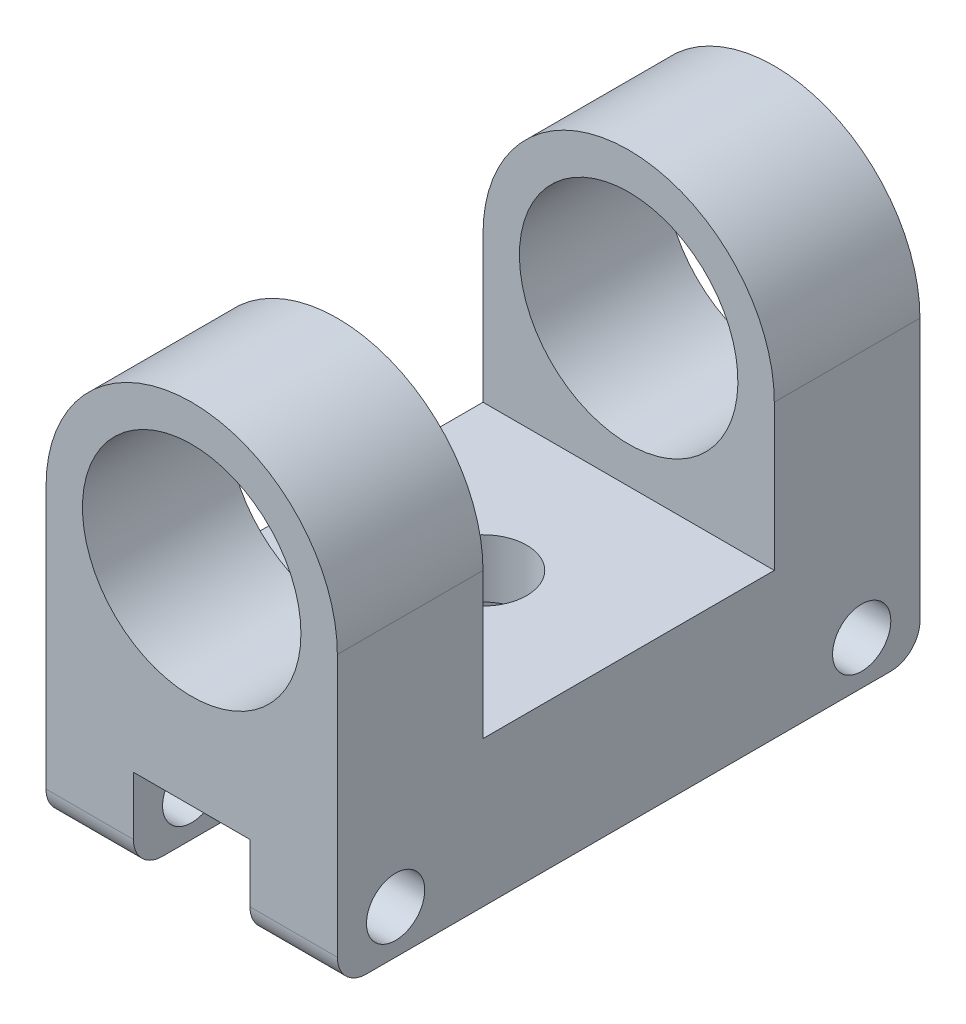
ISO-10303-21;
HEADER;
FILE_DESCRIPTION(('STEP AP214'),'2;1');
FILE_NAME('part.step','',(''),(''),'','','');
FILE_SCHEMA(('AUTOMOTIVE_DESIGN { 1 0 10303 214 1 1 1 1 }'));
ENDSEC;
DATA;
#1=APPLICATION_CONTEXT('core data for automotive mechanical design processes');
#2=APPLICATION_PROTOCOL_DEFINITION('international standard','automotive_design',2000,#1);
#3=PRODUCT_CONTEXT('',#1,'mechanical');
#4=PRODUCT('Part','Part','',(#3));
#5=PRODUCT_RELATED_PRODUCT_CATEGORY('part','',(#4));
#6=PRODUCT_DEFINITION_FORMATION('','',#4);
#7=PRODUCT_DEFINITION_CONTEXT('part definition',#1,'design');
#8=PRODUCT_DEFINITION('design','',#6,#7);
#9=PRODUCT_DEFINITION_SHAPE('','',#8);
#10=(LENGTH_UNIT() NAMED_UNIT(*) SI_UNIT(.MILLI.,.METRE.));
#11=(NAMED_UNIT(*) PLANE_ANGLE_UNIT() SI_UNIT($,.RADIAN.));
#12=(NAMED_UNIT(*) SI_UNIT($,.STERADIAN.) SOLID_ANGLE_UNIT());
#13=UNCERTAINTY_MEASURE_WITH_UNIT(LENGTH_MEASURE(1.E-05),#10,'distance_accuracy_value','');
#14=(GEOMETRIC_REPRESENTATION_CONTEXT(3) GLOBAL_UNCERTAINTY_ASSIGNED_CONTEXT((#13)) GLOBAL_UNIT_ASSIGNED_CONTEXT((#10,
#11,#12)) REPRESENTATION_CONTEXT('',''));
#15=CARTESIAN_POINT('',(0.,0.,0.));
#16=DIRECTION('',(0.,0.,1.));
#17=DIRECTION('',(1.,0.,0.));
#18=AXIS2_PLACEMENT_3D('',#15,#16,#17);
#19=CARTESIAN_POINT('',(50.,100.,200.));
#20=DIRECTION('',(0.,0.,-1.));
#21=DIRECTION('',(-1.,0.,0.));
#22=AXIS2_PLACEMENT_3D('',#19,#20,#21);
#23=CYLINDRICAL_SURFACE('',#22,50.);
#24=CARTESIAN_POINT('',(50.,100.,50.));
#25=DIRECTION('',(0.,0.,-1.));
#26=DIRECTION('',(0.,1.,0.));
#27=AXIS2_PLACEMENT_3D('',#24,#25,#26);
#28=CIRCLE('',#27,50.);
#29=CARTESIAN_POINT('',(0.,100.,50.));
#30=VERTEX_POINT('',#29);
#31=CARTESIAN_POINT('',(100.,100.,50.));
#32=VERTEX_POINT('',#31);
#33=EDGE_CURVE('E240',#30,#32,#28,.T.);
#34=ORIENTED_EDGE('',*,*,#33,.T.);
#35=DIRECTION('',(0.,0.,-1.));
#36=VECTOR('',#35,1.);
#37=CARTESIAN_POINT('',(100.,100.,200.));
#38=LINE('',#37,#36);
#39=CARTESIAN_POINT('',(100.,100.,0.));
#40=VERTEX_POINT('',#39);
#41=EDGE_CURVE('E272',#32,#40,#38,.T.);
#42=ORIENTED_EDGE('',*,*,#41,.T.);
#43=CARTESIAN_POINT('',(50.,100.,0.));
#44=DIRECTION('',(0.,0.,1.));
#45=DIRECTION('',(1.,0.,0.));
#46=AXIS2_PLACEMENT_3D('',#43,#44,#45);
#47=CIRCLE('',#46,50.);
#48=CARTESIAN_POINT('',(0.,100.,0.));
#49=VERTEX_POINT('',#48);
#50=EDGE_CURVE('E248',#40,#49,#47,.T.);
#51=ORIENTED_EDGE('',*,*,#50,.T.);
#52=DIRECTION('',(0.,0.,-1.));
#53=VECTOR('',#52,1.);
#54=CARTESIAN_POINT('',(0.,100.,200.));
#55=LINE('',#54,#53);
#56=EDGE_CURVE('E319',#30,#49,#55,.T.);
#57=ORIENTED_EDGE('',*,*,#56,.F.);
#58=EDGE_LOOP('',(#34,#42,#51,#57));
#59=FACE_BOUND('',#58,.T.);
#60=ADVANCED_FACE('F72',(#59),#23,.T.);
#61=CARTESIAN_POINT('',(50.,100.,200.));
#62=DIRECTION('',(0.,0.,-1.));
#63=DIRECTION('',(-1.,0.,0.));
#64=AXIS2_PLACEMENT_3D('',#61,#62,#63);
#65=CYLINDRICAL_SURFACE('',#64,37.5);
#66=CARTESIAN_POINT('',(50.,100.,50.));
#67=DIRECTION('',(0.,0.,-1.));
#68=DIRECTION('',(0.,1.,0.));
#69=AXIS2_PLACEMENT_3D('',#66,#67,#68);
#70=CIRCLE('',#69,37.5);
#71=CARTESIAN_POINT('',(50.,137.5,50.));
#72=VERTEX_POINT('',#71);
#73=EDGE_CURVE('E239',#72,#72,#70,.T.);
#74=ORIENTED_EDGE('',*,*,#73,.F.);
#75=EDGE_LOOP('',(#74));
#76=FACE_BOUND('',#75,.T.);
#77=CARTESIAN_POINT('',(50.,100.,0.));
#78=DIRECTION('',(0.,0.,1.));
#79=DIRECTION('',(1.,0.,0.));
#80=AXIS2_PLACEMENT_3D('',#77,#78,#79);
#81=CIRCLE('',#80,37.5);
#82=CARTESIAN_POINT('',(87.5,100.,0.));
#83=VERTEX_POINT('',#82);
#84=EDGE_CURVE('E243',#83,#83,#81,.T.);
#85=ORIENTED_EDGE('',*,*,#84,.F.);
#86=EDGE_LOOP('',(#85));
#87=FACE_BOUND('',#86,.T.);
#88=ADVANCED_FACE('F442',(#76,#87),#65,.F.);
#89=CARTESIAN_POINT('',(50.,100.,200.));
#90=DIRECTION('',(0.,0.,1.));
#91=DIRECTION('',(1.,0.,0.));
#92=AXIS2_PLACEMENT_3D('',#89,#90,#91);
#93=PLANE('',#92);
#94=DIRECTION('',(0.,1.,0.));
#95=VECTOR('',#94,1.);
#96=CARTESIAN_POINT('',(0.,0.,200.));
#97=LINE('',#96,#95);
#98=CARTESIAN_POINT('',(0.,9.99999999999999,200.));
#99=VERTEX_POINT('',#98);
#100=CARTESIAN_POINT('',(0.,100.,200.));
#101=VERTEX_POINT('',#100);
#102=EDGE_CURVE('E256',#99,#101,#97,.T.);
#103=ORIENTED_EDGE('',*,*,#102,.F.);
#104=DIRECTION('',(1.,0.,0.));
#105=VECTOR('',#104,1.);
#106=CARTESIAN_POINT('',(30.,9.99999999999999,200.));
#107=LINE('',#106,#105);
#108=CARTESIAN_POINT('',(30.,9.99999999999999,200.));
#109=VERTEX_POINT('',#108);
#110=EDGE_CURVE('E12',#99,#109,#107,.T.);
#111=ORIENTED_EDGE('',*,*,#110,.T.);
#112=DIRECTION('',(0.,1.,0.));
#113=VECTOR('',#112,1.);
#114=CARTESIAN_POINT('',(30.,0.,200.));
#115=LINE('',#114,#113);
#116=CARTESIAN_POINT('',(30.,30.,200.));
#117=VERTEX_POINT('',#116);
#118=EDGE_CURVE('E260',#109,#117,#115,.T.);
#119=ORIENTED_EDGE('',*,*,#118,.T.);
#120=DIRECTION('',(1.,0.,0.));
#121=VECTOR('',#120,1.);
#122=CARTESIAN_POINT('',(30.,30.,200.));
#123=LINE('',#122,#121);
#124=CARTESIAN_POINT('',(70.,30.,200.));
#125=VERTEX_POINT('',#124);
#126=EDGE_CURVE('E263',#117,#125,#123,.T.);
#127=ORIENTED_EDGE('',*,*,#126,.T.);
#128=DIRECTION('',(0.,-1.,0.));
#129=VECTOR('',#128,1.);
#130=CARTESIAN_POINT('',(70.,30.,200.));
#131=LINE('',#130,#129);
#132=CARTESIAN_POINT('',(70.,9.99999999999999,200.));
#133=VERTEX_POINT('',#132);
#134=EDGE_CURVE('E266',#125,#133,#131,.T.);
#135=ORIENTED_EDGE('',*,*,#134,.T.);
#136=DIRECTION('',(1.,0.,0.));
#137=VECTOR('',#136,1.);
#138=CARTESIAN_POINT('',(100.,9.99999999999999,200.));
#139=LINE('',#138,#137);
#140=CARTESIAN_POINT('',(100.,9.99999999999999,200.));
#141=VERTEX_POINT('',#140);
#142=EDGE_CURVE('E81',#133,#141,#139,.T.);
#143=ORIENTED_EDGE('',*,*,#142,.T.);
#144=DIRECTION('',(0.,1.,0.));
#145=VECTOR('',#144,1.);
#146=CARTESIAN_POINT('',(100.,0.,200.));
#147=LINE('',#146,#145);
#148=CARTESIAN_POINT('',(100.,100.,200.));
#149=VERTEX_POINT('',#148);
#150=EDGE_CURVE('E269',#141,#149,#147,.T.);
#151=ORIENTED_EDGE('',*,*,#150,.T.);
#152=CARTESIAN_POINT('',(50.,100.,200.));
#153=DIRECTION('',(0.,0.,1.));
#154=DIRECTION('',(1.,0.,0.));
#155=AXIS2_PLACEMENT_3D('',#152,#153,#154);
#156=CIRCLE('',#155,50.);
#157=EDGE_CURVE('E252',#149,#101,#156,.T.);
#158=ORIENTED_EDGE('',*,*,#157,.T.);
#159=EDGE_LOOP('',(#103,#111,#119,#127,#135,#143,#151,#158));
#160=FACE_BOUND('',#159,.T.);
#161=CARTESIAN_POINT('',(50.,100.,200.));
#162=DIRECTION('',(0.,0.,1.));
#163=DIRECTION('',(1.,0.,0.));
#164=AXIS2_PLACEMENT_3D('',#161,#162,#163);
#165=CIRCLE('',#164,37.5);
#166=CARTESIAN_POINT('',(87.5,100.,200.));
#167=VERTEX_POINT('',#166);
#168=EDGE_CURVE('E244',#167,#167,#165,.T.);
#169=ORIENTED_EDGE('',*,*,#168,.F.);
#170=EDGE_LOOP('',(#169));
#171=FACE_BOUND('',#170,.T.);
#172=ADVANCED_FACE('F373',(#160,#171),#93,.T.);
#173=CARTESIAN_POINT('',(50.,100.,0.));
#174=DIRECTION('',(0.,0.,1.));
#175=DIRECTION('',(1.,0.,0.));
#176=AXIS2_PLACEMENT_3D('',#173,#174,#175);
#177=PLANE('',#176);
#178=DIRECTION('',(0.,1.,0.));
#179=VECTOR('',#178,1.);
#180=CARTESIAN_POINT('',(30.,0.,0.));
#181=LINE('',#180,#179);
#182=CARTESIAN_POINT('',(30.,10.,0.));
#183=VERTEX_POINT('',#182);
#184=CARTESIAN_POINT('',(30.,30.,0.));
#185=VERTEX_POINT('',#184);
#186=EDGE_CURVE('E279',#183,#185,#181,.T.);
#187=ORIENTED_EDGE('',*,*,#186,.F.);
#188=DIRECTION('',(1.,0.,0.));
#189=VECTOR('',#188,1.);
#190=CARTESIAN_POINT('',(50.,9.99999999999999,0.));
#191=LINE('',#190,#189);
#192=CARTESIAN_POINT('',(0.,10.,0.));
#193=VERTEX_POINT('',#192);
#194=EDGE_CURVE('E344',#183,#193,#191,.F.);
#195=ORIENTED_EDGE('',*,*,#194,.T.);
#196=DIRECTION('',(0.,1.,0.));
#197=VECTOR('',#196,1.);
#198=CARTESIAN_POINT('',(0.,0.,0.));
#199=LINE('',#198,#197);
#200=EDGE_CURVE('E276',#193,#49,#199,.T.);
#201=ORIENTED_EDGE('',*,*,#200,.T.);
#202=ORIENTED_EDGE('',*,*,#50,.F.);
#203=DIRECTION('',(0.,1.,0.));
#204=VECTOR('',#203,1.);
#205=CARTESIAN_POINT('',(100.,0.,0.));
#206=LINE('',#205,#204);
#207=CARTESIAN_POINT('',(100.,10.,0.));
#208=VERTEX_POINT('',#207);
#209=EDGE_CURVE('E257',#208,#40,#206,.T.);
#210=ORIENTED_EDGE('',*,*,#209,.F.);
#211=DIRECTION('',(1.,0.,0.));
#212=VECTOR('',#211,1.);
#213=CARTESIAN_POINT('',(50.,9.99999999999999,0.));
#214=LINE('',#213,#212);
#215=CARTESIAN_POINT('',(70.,10.,0.));
#216=VERTEX_POINT('',#215);
#217=EDGE_CURVE('E341',#208,#216,#214,.F.);
#218=ORIENTED_EDGE('',*,*,#217,.T.);
#219=DIRECTION('',(0.,-1.,0.));
#220=VECTOR('',#219,1.);
#221=CARTESIAN_POINT('',(70.,30.,0.));
#222=LINE('',#221,#220);
#223=CARTESIAN_POINT('',(70.,30.,0.));
#224=VERTEX_POINT('',#223);
#225=EDGE_CURVE('E285',#224,#216,#222,.T.);
#226=ORIENTED_EDGE('',*,*,#225,.F.);
#227=DIRECTION('',(1.,0.,0.));
#228=VECTOR('',#227,1.);
#229=CARTESIAN_POINT('',(30.,30.,0.));
#230=LINE('',#229,#228);
#231=EDGE_CURVE('E282',#185,#224,#230,.T.);
#232=ORIENTED_EDGE('',*,*,#231,.F.);
#233=EDGE_LOOP('',(#187,#195,#201,#202,#210,#218,#226,#232));
#234=FACE_BOUND('',#233,.T.);
#235=ORIENTED_EDGE('',*,*,#84,.T.);
#236=EDGE_LOOP('',(#235));
#237=FACE_BOUND('',#236,.T.);
#238=ADVANCED_FACE('F403',(#234,#237),#177,.F.);
#239=CARTESIAN_POINT('',(100.,100.,150.));
#240=VERTEX_POINT('',#239);
#241=EDGE_CURVE('E291',#149,#240,#38,.T.);
#242=ORIENTED_EDGE('',*,*,#241,.T.);
#243=CARTESIAN_POINT('',(50.,100.,150.));
#244=DIRECTION('',(0.,0.,1.));
#245=DIRECTION('',(1.,0.,0.));
#246=AXIS2_PLACEMENT_3D('',#243,#244,#245);
#247=CIRCLE('',#246,50.);
#248=CARTESIAN_POINT('',(0.,100.,150.));
#249=VERTEX_POINT('',#248);
#250=EDGE_CURVE('E236',#240,#249,#247,.T.);
#251=ORIENTED_EDGE('',*,*,#250,.T.);
#252=EDGE_CURVE('E215',#101,#249,#55,.T.);
#253=ORIENTED_EDGE('',*,*,#252,.F.);
#254=ORIENTED_EDGE('',*,*,#157,.F.);
#255=EDGE_LOOP('',(#242,#251,#253,#254));
#256=FACE_BOUND('',#255,.T.);
#257=ADVANCED_FACE('F381',(#256),#23,.T.);
#258=CARTESIAN_POINT('',(0.,0.,200.));
#259=DIRECTION('',(-1.,0.,0.));
#260=DIRECTION('',(0.,0.,1.));
#261=AXIS2_PLACEMENT_3D('',#258,#259,#260);
#262=PLANE('',#261);
#263=CARTESIAN_POINT('',(0.,15.,180.));
#264=DIRECTION('',(1.,0.,0.));
#265=DIRECTION('',(0.,0.,-1.));
#266=AXIS2_PLACEMENT_3D('',#263,#264,#265);
#267=CIRCLE('',#266,10.);
#268=CARTESIAN_POINT('',(0.,15.,170.));
#269=VERTEX_POINT('',#268);
#270=EDGE_CURVE('E656',#269,#269,#267,.T.);
#271=ORIENTED_EDGE('',*,*,#270,.T.);
#272=EDGE_LOOP('',(#271));
#273=FACE_BOUND('',#272,.T.);
#274=CARTESIAN_POINT('',(0.,15.,20.));
#275=DIRECTION('',(1.,0.,0.));
#276=DIRECTION('',(0.,0.,-1.));
#277=AXIS2_PLACEMENT_3D('',#274,#275,#276);
#278=CIRCLE('',#277,10.);
#279=CARTESIAN_POINT('',(0.,15.,10.));
#280=VERTEX_POINT('',#279);
#281=EDGE_CURVE('E667',#280,#280,#278,.T.);
#282=ORIENTED_EDGE('',*,*,#281,.T.);
#283=EDGE_LOOP('',(#282));
#284=FACE_BOUND('',#283,.T.);
#285=ORIENTED_EDGE('',*,*,#200,.F.);
#286=CARTESIAN_POINT('',(0.,10.,10.));
#287=DIRECTION('',(-1.,0.,0.));
#288=DIRECTION('',(0.,0.,1.));
#289=AXIS2_PLACEMENT_3D('',#286,#287,#288);
#290=CIRCLE('',#289,10.);
#291=CARTESIAN_POINT('',(0.,0.,10.));
#292=VERTEX_POINT('',#291);
#293=EDGE_CURVE('E350',#193,#292,#290,.T.);
#294=ORIENTED_EDGE('',*,*,#293,.T.);
#295=DIRECTION('',(0.,0.,-1.));
#296=VECTOR('',#295,1.);
#297=CARTESIAN_POINT('',(0.,0.,200.));
#298=LINE('',#297,#296);
#299=CARTESIAN_POINT('',(0.,0.,190.));
#300=VERTEX_POINT('',#299);
#301=EDGE_CURVE('E315',#300,#292,#298,.T.);
#302=ORIENTED_EDGE('',*,*,#301,.F.);
#303=CARTESIAN_POINT('',(0.,9.99999999999999,190.));
#304=DIRECTION('',(-1.,0.,0.));
#305=DIRECTION('',(0.,0.,1.));
#306=AXIS2_PLACEMENT_3D('',#303,#304,#305);
#307=CIRCLE('',#306,10.);
#308=EDGE_CURVE('E347',#300,#99,#307,.T.);
#309=ORIENTED_EDGE('',*,*,#308,.T.);
#310=ORIENTED_EDGE('',*,*,#102,.T.);
#311=ORIENTED_EDGE('',*,*,#252,.T.);
#312=DIRECTION('',(0.,-1.,0.));
#313=VECTOR('',#312,1.);
#314=CARTESIAN_POINT('',(0.,150.,150.));
#315=LINE('',#314,#313);
#316=CARTESIAN_POINT('',(0.,50.,150.));
#317=VERTEX_POINT('',#316);
#318=EDGE_CURVE('E193',#249,#317,#315,.T.);
#319=ORIENTED_EDGE('',*,*,#318,.T.);
#320=DIRECTION('',(0.,0.,-1.));
#321=VECTOR('',#320,1.);
#322=CARTESIAN_POINT('',(0.,50.,150.));
#323=LINE('',#322,#321);
#324=CARTESIAN_POINT('',(0.,50.,50.));
#325=VERTEX_POINT('',#324);
#326=EDGE_CURVE('E205',#317,#325,#323,.T.);
#327=ORIENTED_EDGE('',*,*,#326,.T.);
#328=DIRECTION('',(0.,1.,0.));
#329=VECTOR('',#328,1.);
#330=CARTESIAN_POINT('',(0.,150.,50.));
#331=LINE('',#330,#329);
#332=EDGE_CURVE('E202',#325,#30,#331,.T.);
#333=ORIENTED_EDGE('',*,*,#332,.T.);
#334=ORIENTED_EDGE('',*,*,#56,.T.);
#335=EDGE_LOOP('',(#285,#294,#302,#309,#310,#311,#319,#327,#333,#334));
#336=FACE_BOUND('',#335,.T.);
#337=ADVANCED_FACE('F213',(#273,#284,#336),#262,.T.);
#338=CARTESIAN_POINT('',(0.,0.,200.));
#339=DIRECTION('',(0.,1.,0.));
#340=DIRECTION('',(0.,0.,1.));
#341=AXIS2_PLACEMENT_3D('',#338,#339,#340);
#342=PLANE('',#341);
#343=ORIENTED_EDGE('',*,*,#301,.T.);
#344=DIRECTION('',(1.,0.,0.));
#345=VECTOR('',#344,1.);
#346=CARTESIAN_POINT('',(0.,0.,10.));
#347=LINE('',#346,#345);
#348=CARTESIAN_POINT('',(30.,0.,10.));
#349=VERTEX_POINT('',#348);
#350=EDGE_CURVE('E331',#292,#349,#347,.T.);
#351=ORIENTED_EDGE('',*,*,#350,.T.);
#352=DIRECTION('',(0.,0.,-1.));
#353=VECTOR('',#352,1.);
#354=CARTESIAN_POINT('',(30.,0.,200.));
#355=LINE('',#354,#353);
#356=CARTESIAN_POINT('',(30.,0.,190.));
#357=VERTEX_POINT('',#356);
#358=EDGE_CURVE('E311',#357,#349,#355,.T.);
#359=ORIENTED_EDGE('',*,*,#358,.F.);
#360=DIRECTION('',(1.,0.,0.));
#361=VECTOR('',#360,1.);
#362=CARTESIAN_POINT('',(0.,0.,190.));
#363=LINE('',#362,#361);
#364=EDGE_CURVE('E322',#357,#300,#363,.F.);
#365=ORIENTED_EDGE('',*,*,#364,.T.);
#366=EDGE_LOOP('',(#343,#351,#359,#365));
#367=FACE_BOUND('',#366,.T.);
#368=ADVANCED_FACE('F393',(#367),#342,.F.);
#369=CARTESIAN_POINT('',(30.,0.,200.));
#370=DIRECTION('',(-1.,0.,0.));
#371=DIRECTION('',(0.,0.,1.));
#372=AXIS2_PLACEMENT_3D('',#369,#370,#371);
#373=PLANE('',#372);
#374=CARTESIAN_POINT('',(30.,15.,180.));
#375=DIRECTION('',(-1.,0.,0.));
#376=DIRECTION('',(0.,0.,1.));
#377=AXIS2_PLACEMENT_3D('',#374,#375,#376);
#378=CIRCLE('',#377,10.);
#379=CARTESIAN_POINT('',(30.,15.,190.));
#380=VERTEX_POINT('',#379);
#381=EDGE_CURVE('E224',#380,#380,#378,.T.);
#382=ORIENTED_EDGE('',*,*,#381,.T.);
#383=EDGE_LOOP('',(#382));
#384=FACE_BOUND('',#383,.T.);
#385=CARTESIAN_POINT('',(30.,15.,20.));
#386=DIRECTION('',(-1.,0.,0.));
#387=DIRECTION('',(0.,0.,1.));
#388=AXIS2_PLACEMENT_3D('',#385,#386,#387);
#389=CIRCLE('',#388,10.);
#390=CARTESIAN_POINT('',(30.,15.,30.));
#391=VERTEX_POINT('',#390);
#392=EDGE_CURVE('E655',#391,#391,#389,.T.);
#393=ORIENTED_EDGE('',*,*,#392,.T.);
#394=EDGE_LOOP('',(#393));
#395=FACE_BOUND('',#394,.T.);
#396=ORIENTED_EDGE('',*,*,#358,.T.);
#397=CARTESIAN_POINT('',(30.,10.,10.));
#398=DIRECTION('',(-1.,0.,0.));
#399=DIRECTION('',(0.,0.,1.));
#400=AXIS2_PLACEMENT_3D('',#397,#398,#399);
#401=CIRCLE('',#400,10.);
#402=EDGE_CURVE('E338',#349,#183,#401,.F.);
#403=ORIENTED_EDGE('',*,*,#402,.T.);
#404=ORIENTED_EDGE('',*,*,#186,.T.);
#405=DIRECTION('',(0.,0.,-1.));
#406=VECTOR('',#405,1.);
#407=CARTESIAN_POINT('',(30.,30.,200.));
#408=LINE('',#407,#406);
#409=EDGE_CURVE('E307',#117,#185,#408,.T.);
#410=ORIENTED_EDGE('',*,*,#409,.F.);
#411=ORIENTED_EDGE('',*,*,#118,.F.);
#412=CARTESIAN_POINT('',(30.,9.99999999999999,190.));
#413=DIRECTION('',(-1.,0.,0.));
#414=DIRECTION('',(0.,0.,1.));
#415=AXIS2_PLACEMENT_3D('',#412,#413,#414);
#416=CIRCLE('',#415,10.);
#417=EDGE_CURVE('E335',#109,#357,#416,.F.);
#418=ORIENTED_EDGE('',*,*,#417,.T.);
#419=EDGE_LOOP('',(#396,#403,#404,#410,#411,#418));
#420=FACE_BOUND('',#419,.T.);
#421=ADVANCED_FACE('F390',(#384,#395,#420),#373,.F.);
#422=CARTESIAN_POINT('',(30.,30.,200.));
#423=DIRECTION('',(0.,1.,0.));
#424=DIRECTION('',(0.,0.,1.));
#425=AXIS2_PLACEMENT_3D('',#422,#423,#424);
#426=PLANE('',#425);
#427=CARTESIAN_POINT('',(50.,30.,100.));
#428=DIRECTION('',(0.,1.,0.));
#429=DIRECTION('',(0.,0.,1.));
#430=AXIS2_PLACEMENT_3D('',#427,#428,#429);
#431=CIRCLE('',#430,15.);
#432=CARTESIAN_POINT('',(50.,30.,115.));
#433=VERTEX_POINT('',#432);
#434=EDGE_CURVE('E682',#433,#433,#431,.T.);
#435=ORIENTED_EDGE('',*,*,#434,.T.);
#436=EDGE_LOOP('',(#435));
#437=FACE_BOUND('',#436,.T.);
#438=ORIENTED_EDGE('',*,*,#231,.T.);
#439=DIRECTION('',(0.,0.,-1.));
#440=VECTOR('',#439,1.);
#441=CARTESIAN_POINT('',(70.,30.,200.));
#442=LINE('',#441,#440);
#443=EDGE_CURVE('E303',#125,#224,#442,.T.);
#444=ORIENTED_EDGE('',*,*,#443,.F.);
#445=ORIENTED_EDGE('',*,*,#126,.F.);
#446=ORIENTED_EDGE('',*,*,#409,.T.);
#447=EDGE_LOOP('',(#438,#444,#445,#446));
#448=FACE_BOUND('',#447,.T.);
#449=ADVANCED_FACE('F408',(#437,#448),#426,.F.);
#450=CARTESIAN_POINT('',(70.,30.,200.));
#451=DIRECTION('',(1.,0.,0.));
#452=DIRECTION('',(0.,0.,-1.));
#453=AXIS2_PLACEMENT_3D('',#450,#451,#452);
#454=PLANE('',#453);
#455=CARTESIAN_POINT('',(70.,15.,180.));
#456=DIRECTION('',(1.,0.,0.));
#457=DIRECTION('',(0.,0.,-1.));
#458=AXIS2_PLACEMENT_3D('',#455,#456,#457);
#459=CIRCLE('',#458,10.);
#460=CARTESIAN_POINT('',(70.,15.,170.));
#461=VERTEX_POINT('',#460);
#462=EDGE_CURVE('E661',#461,#461,#459,.T.);
#463=ORIENTED_EDGE('',*,*,#462,.T.);
#464=EDGE_LOOP('',(#463));
#465=FACE_BOUND('',#464,.T.);
#466=CARTESIAN_POINT('',(70.,15.,20.));
#467=DIRECTION('',(1.,0.,0.));
#468=DIRECTION('',(0.,0.,-1.));
#469=AXIS2_PLACEMENT_3D('',#466,#467,#468);
#470=CIRCLE('',#469,10.);
#471=CARTESIAN_POINT('',(70.,15.,10.));
#472=VERTEX_POINT('',#471);
#473=EDGE_CURVE('E652',#472,#472,#470,.T.);
#474=ORIENTED_EDGE('',*,*,#473,.T.);
#475=EDGE_LOOP('',(#474));
#476=FACE_BOUND('',#475,.T.);
#477=ORIENTED_EDGE('',*,*,#225,.T.);
#478=CARTESIAN_POINT('',(70.,10.,10.));
#479=DIRECTION('',(1.,0.,0.));
#480=DIRECTION('',(0.,0.,-1.));
#481=AXIS2_PLACEMENT_3D('',#478,#479,#480);
#482=CIRCLE('',#481,10.);
#483=CARTESIAN_POINT('',(70.,0.,10.));
#484=VERTEX_POINT('',#483);
#485=EDGE_CURVE('E367',#216,#484,#482,.F.);
#486=ORIENTED_EDGE('',*,*,#485,.T.);
#487=DIRECTION('',(0.,0.,-1.));
#488=VECTOR('',#487,1.);
#489=CARTESIAN_POINT('',(70.,0.,200.));
#490=LINE('',#489,#488);
#491=CARTESIAN_POINT('',(70.,0.,190.));
#492=VERTEX_POINT('',#491);
#493=EDGE_CURVE('E299',#492,#484,#490,.T.);
#494=ORIENTED_EDGE('',*,*,#493,.F.);
#495=CARTESIAN_POINT('',(70.,9.99999999999999,190.));
#496=DIRECTION('',(1.,0.,0.));
#497=DIRECTION('',(0.,0.,-1.));
#498=AXIS2_PLACEMENT_3D('',#495,#496,#497);
#499=CIRCLE('',#498,10.);
#500=EDGE_CURVE('E88',#492,#133,#499,.F.);
#501=ORIENTED_EDGE('',*,*,#500,.T.);
#502=ORIENTED_EDGE('',*,*,#134,.F.);
#503=ORIENTED_EDGE('',*,*,#443,.T.);
#504=EDGE_LOOP('',(#477,#486,#494,#501,#502,#503));
#505=FACE_BOUND('',#504,.T.);
#506=ADVANCED_FACE('F410',(#465,#476,#505),#454,.F.);
#507=CARTESIAN_POINT('',(70.,0.,200.));
#508=DIRECTION('',(0.,1.,0.));
#509=DIRECTION('',(0.,0.,1.));
#510=AXIS2_PLACEMENT_3D('',#507,#508,#509);
#511=PLANE('',#510);
#512=ORIENTED_EDGE('',*,*,#493,.T.);
#513=DIRECTION('',(1.,0.,0.));
#514=VECTOR('',#513,1.);
#515=CARTESIAN_POINT('',(70.,0.,10.));
#516=LINE('',#515,#514);
#517=CARTESIAN_POINT('',(100.,0.,10.));
#518=VERTEX_POINT('',#517);
#519=EDGE_CURVE('E356',#484,#518,#516,.T.);
#520=ORIENTED_EDGE('',*,*,#519,.T.);
#521=DIRECTION('',(0.,0.,-1.));
#522=VECTOR('',#521,1.);
#523=CARTESIAN_POINT('',(100.,0.,200.));
#524=LINE('',#523,#522);
#525=CARTESIAN_POINT('',(100.,0.,190.));
#526=VERTEX_POINT('',#525);
#527=EDGE_CURVE('E295',#526,#518,#524,.T.);
#528=ORIENTED_EDGE('',*,*,#527,.F.);
#529=DIRECTION('',(1.,0.,0.));
#530=VECTOR('',#529,1.);
#531=CARTESIAN_POINT('',(70.,0.,190.));
#532=LINE('',#531,#530);
#533=EDGE_CURVE('E353',#526,#492,#532,.F.);
#534=ORIENTED_EDGE('',*,*,#533,.T.);
#535=EDGE_LOOP('',(#512,#520,#528,#534));
#536=FACE_BOUND('',#535,.T.);
#537=ADVANCED_FACE('F417',(#536),#511,.F.);
#538=CARTESIAN_POINT('',(100.,0.,200.));
#539=DIRECTION('',(-1.,0.,0.));
#540=DIRECTION('',(0.,0.,1.));
#541=AXIS2_PLACEMENT_3D('',#538,#539,#540);
#542=PLANE('',#541);
#543=CARTESIAN_POINT('',(100.,15.,180.));
#544=DIRECTION('',(1.,0.,0.));
#545=DIRECTION('',(0.,0.,-1.));
#546=AXIS2_PLACEMENT_3D('',#543,#544,#545);
#547=CIRCLE('',#546,10.);
#548=CARTESIAN_POINT('',(100.,15.,170.));
#549=VERTEX_POINT('',#548);
#550=EDGE_CURVE('E664',#549,#549,#547,.T.);
#551=ORIENTED_EDGE('',*,*,#550,.F.);
#552=EDGE_LOOP('',(#551));
#553=FACE_BOUND('',#552,.T.);
#554=CARTESIAN_POINT('',(100.,15.,20.));
#555=DIRECTION('',(1.,0.,0.));
#556=DIRECTION('',(0.,0.,-1.));
#557=AXIS2_PLACEMENT_3D('',#554,#555,#556);
#558=CIRCLE('',#557,10.);
#559=CARTESIAN_POINT('',(100.,15.,10.));
#560=VERTEX_POINT('',#559);
#561=EDGE_CURVE('E649',#560,#560,#558,.T.);
#562=ORIENTED_EDGE('',*,*,#561,.F.);
#563=EDGE_LOOP('',(#562));
#564=FACE_BOUND('',#563,.T.);
#565=ORIENTED_EDGE('',*,*,#527,.T.);
#566=CARTESIAN_POINT('',(100.,10.,10.));
#567=DIRECTION('',(-1.,0.,0.));
#568=DIRECTION('',(0.,0.,1.));
#569=AXIS2_PLACEMENT_3D('',#566,#567,#568);
#570=CIRCLE('',#569,10.);
#571=EDGE_CURVE('E362',#518,#208,#570,.F.);
#572=ORIENTED_EDGE('',*,*,#571,.T.);
#573=ORIENTED_EDGE('',*,*,#209,.T.);
#574=ORIENTED_EDGE('',*,*,#41,.F.);
#575=DIRECTION('',(0.,1.,0.));
#576=VECTOR('',#575,1.);
#577=CARTESIAN_POINT('',(100.,150.,50.));
#578=LINE('',#577,#576);
#579=CARTESIAN_POINT('',(100.,50.,50.));
#580=VERTEX_POINT('',#579);
#581=EDGE_CURVE('E217',#580,#32,#578,.T.);
#582=ORIENTED_EDGE('',*,*,#581,.F.);
#583=DIRECTION('',(0.,0.,-1.));
#584=VECTOR('',#583,1.);
#585=CARTESIAN_POINT('',(100.,50.,150.));
#586=LINE('',#585,#584);
#587=CARTESIAN_POINT('',(100.,50.,150.));
#588=VERTEX_POINT('',#587);
#589=EDGE_CURVE('E221',#588,#580,#586,.T.);
#590=ORIENTED_EDGE('',*,*,#589,.F.);
#591=DIRECTION('',(0.,-1.,0.));
#592=VECTOR('',#591,1.);
#593=CARTESIAN_POINT('',(100.,150.,150.));
#594=LINE('',#593,#592);
#595=EDGE_CURVE('E196',#240,#588,#594,.T.);
#596=ORIENTED_EDGE('',*,*,#595,.F.);
#597=ORIENTED_EDGE('',*,*,#241,.F.);
#598=ORIENTED_EDGE('',*,*,#150,.F.);
#599=CARTESIAN_POINT('',(100.,9.99999999999999,190.));
#600=DIRECTION('',(-1.,0.,0.));
#601=DIRECTION('',(0.,0.,1.));
#602=AXIS2_PLACEMENT_3D('',#599,#600,#601);
#603=CIRCLE('',#602,10.);
#604=EDGE_CURVE('E96',#141,#526,#603,.F.);
#605=ORIENTED_EDGE('',*,*,#604,.T.);
#606=EDGE_LOOP('',(#565,#572,#573,#574,#582,#590,#596,#597,#598,#605));
#607=FACE_BOUND('',#606,.T.);
#608=ADVANCED_FACE('F377',(#553,#564,#607),#542,.F.);
#609=CARTESIAN_POINT('',(50.,100.,150.));
#610=DIRECTION('',(0.,0.,1.));
#611=DIRECTION('',(1.,0.,0.));
#612=AXIS2_PLACEMENT_3D('',#609,#610,#611);
#613=CIRCLE('',#612,37.5);
#614=CARTESIAN_POINT('',(87.5,100.,150.));
#615=VERTEX_POINT('',#614);
#616=EDGE_CURVE('E234',#615,#615,#613,.T.);
#617=ORIENTED_EDGE('',*,*,#616,.F.);
#618=EDGE_LOOP('',(#617));
#619=FACE_BOUND('',#618,.T.);
#620=ORIENTED_EDGE('',*,*,#168,.T.);
#621=EDGE_LOOP('',(#620));
#622=FACE_BOUND('',#621,.T.);
#623=ADVANCED_FACE('F431',(#619,#622),#65,.F.);
#624=CARTESIAN_POINT('',(0.,150.,50.));
#625=DIRECTION('',(0.,0.,-1.));
#626=DIRECTION('',(0.,1.,0.));
#627=AXIS2_PLACEMENT_3D('',#624,#625,#626);
#628=PLANE('',#627);
#629=ORIENTED_EDGE('',*,*,#73,.T.);
#630=EDGE_LOOP('',(#629));
#631=FACE_BOUND('',#630,.T.);
#632=ORIENTED_EDGE('',*,*,#33,.F.);
#633=ORIENTED_EDGE('',*,*,#332,.F.);
#634=DIRECTION('',(1.,0.,0.));
#635=VECTOR('',#634,1.);
#636=CARTESIAN_POINT('',(0.,50.,50.));
#637=LINE('',#636,#635);
#638=EDGE_CURVE('E201',#325,#580,#637,.T.);
#639=ORIENTED_EDGE('',*,*,#638,.T.);
#640=ORIENTED_EDGE('',*,*,#581,.T.);
#641=EDGE_LOOP('',(#632,#633,#639,#640));
#642=FACE_BOUND('',#641,.T.);
#643=ADVANCED_FACE('F429',(#631,#642),#628,.F.);
#644=CARTESIAN_POINT('',(0.,150.,150.));
#645=DIRECTION('',(0.,0.,1.));
#646=DIRECTION('',(1.,0.,0.));
#647=AXIS2_PLACEMENT_3D('',#644,#645,#646);
#648=PLANE('',#647);
#649=ORIENTED_EDGE('',*,*,#616,.T.);
#650=EDGE_LOOP('',(#649));
#651=FACE_BOUND('',#650,.T.);
#652=ORIENTED_EDGE('',*,*,#595,.T.);
#653=DIRECTION('',(1.,0.,0.));
#654=VECTOR('',#653,1.);
#655=CARTESIAN_POINT('',(0.,50.,150.));
#656=LINE('',#655,#654);
#657=EDGE_CURVE('E189',#317,#588,#656,.T.);
#658=ORIENTED_EDGE('',*,*,#657,.F.);
#659=ORIENTED_EDGE('',*,*,#318,.F.);
#660=ORIENTED_EDGE('',*,*,#250,.F.);
#661=EDGE_LOOP('',(#652,#658,#659,#660));
#662=FACE_BOUND('',#661,.T.);
#663=ADVANCED_FACE('F191',(#651,#662),#648,.F.);
#664=CARTESIAN_POINT('',(0.,50.,150.));
#665=DIRECTION('',(0.,-1.,0.));
#666=DIRECTION('',(0.,0.,-1.));
#667=AXIS2_PLACEMENT_3D('',#664,#665,#666);
#668=PLANE('',#667);
#669=CARTESIAN_POINT('',(50.,50.,100.));
#670=DIRECTION('',(0.,1.,0.));
#671=DIRECTION('',(0.,0.,1.));
#672=AXIS2_PLACEMENT_3D('',#669,#670,#671);
#673=CIRCLE('',#672,15.);
#674=CARTESIAN_POINT('',(50.,50.,115.));
#675=VERTEX_POINT('',#674);
#676=EDGE_CURVE('E691',#675,#675,#673,.T.);
#677=ORIENTED_EDGE('',*,*,#676,.F.);
#678=EDGE_LOOP('',(#677));
#679=FACE_BOUND('',#678,.T.);
#680=ORIENTED_EDGE('',*,*,#589,.T.);
#681=ORIENTED_EDGE('',*,*,#638,.F.);
#682=ORIENTED_EDGE('',*,*,#326,.F.);
#683=ORIENTED_EDGE('',*,*,#657,.T.);
#684=EDGE_LOOP('',(#680,#681,#682,#683));
#685=FACE_BOUND('',#684,.T.);
#686=ADVANCED_FACE('F206',(#679,#685),#668,.F.);
#687=CARTESIAN_POINT('',(0.,15.,20.));
#688=DIRECTION('',(1.,0.,0.));
#689=DIRECTION('',(0.,0.,-1.));
#690=AXIS2_PLACEMENT_3D('',#687,#688,#689);
#691=CYLINDRICAL_SURFACE('',#690,10.);
#692=ORIENTED_EDGE('',*,*,#561,.T.);
#693=EDGE_LOOP('',(#692));
#694=FACE_BOUND('',#693,.T.);
#695=ORIENTED_EDGE('',*,*,#473,.F.);
#696=EDGE_LOOP('',(#695));
#697=FACE_BOUND('',#696,.T.);
#698=ADVANCED_FACE('F546',(#694,#697),#691,.F.);
#699=CARTESIAN_POINT('',(0.,15.,180.));
#700=DIRECTION('',(1.,0.,0.));
#701=DIRECTION('',(0.,0.,-1.));
#702=AXIS2_PLACEMENT_3D('',#699,#700,#701);
#703=CYLINDRICAL_SURFACE('',#702,10.);
#704=ORIENTED_EDGE('',*,*,#550,.T.);
#705=EDGE_LOOP('',(#704));
#706=FACE_BOUND('',#705,.T.);
#707=ORIENTED_EDGE('',*,*,#462,.F.);
#708=EDGE_LOOP('',(#707));
#709=FACE_BOUND('',#708,.T.);
#710=ADVANCED_FACE('F571',(#706,#709),#703,.F.);
#711=ORIENTED_EDGE('',*,*,#281,.F.);
#712=EDGE_LOOP('',(#711));
#713=FACE_BOUND('',#712,.T.);
#714=ORIENTED_EDGE('',*,*,#392,.F.);
#715=EDGE_LOOP('',(#714));
#716=FACE_BOUND('',#715,.T.);
#717=ADVANCED_FACE('F568',(#713,#716),#691,.F.);
#718=ORIENTED_EDGE('',*,*,#270,.F.);
#719=EDGE_LOOP('',(#718));
#720=FACE_BOUND('',#719,.T.);
#721=ORIENTED_EDGE('',*,*,#381,.F.);
#722=EDGE_LOOP('',(#721));
#723=FACE_BOUND('',#722,.T.);
#724=ADVANCED_FACE('F513',(#720,#723),#703,.F.);
#725=CARTESIAN_POINT('',(0.,10.,10.));
#726=DIRECTION('',(1.,0.,0.));
#727=DIRECTION('',(0.,0.,-1.));
#728=AXIS2_PLACEMENT_3D('',#725,#726,#727);
#729=CYLINDRICAL_SURFACE('',#728,10.);
#730=ORIENTED_EDGE('',*,*,#293,.F.);
#731=ORIENTED_EDGE('',*,*,#194,.F.);
#732=ORIENTED_EDGE('',*,*,#402,.F.);
#733=ORIENTED_EDGE('',*,*,#350,.F.);
#734=EDGE_LOOP('',(#730,#731,#732,#733));
#735=FACE_BOUND('',#734,.T.);
#736=ADVANCED_FACE('F398',(#735),#729,.T.);
#737=CARTESIAN_POINT('',(70.,10.,10.));
#738=DIRECTION('',(1.,0.,0.));
#739=DIRECTION('',(0.,0.,-1.));
#740=AXIS2_PLACEMENT_3D('',#737,#738,#739);
#741=CYLINDRICAL_SURFACE('',#740,10.);
#742=ORIENTED_EDGE('',*,*,#485,.F.);
#743=ORIENTED_EDGE('',*,*,#217,.F.);
#744=ORIENTED_EDGE('',*,*,#571,.F.);
#745=ORIENTED_EDGE('',*,*,#519,.F.);
#746=EDGE_LOOP('',(#742,#743,#744,#745));
#747=FACE_BOUND('',#746,.T.);
#748=ADVANCED_FACE('F415',(#747),#741,.T.);
#749=CARTESIAN_POINT('',(50.,9.99999999999999,190.));
#750=DIRECTION('',(-1.,0.,0.));
#751=DIRECTION('',(0.,0.,1.));
#752=AXIS2_PLACEMENT_3D('',#749,#750,#751);
#753=CYLINDRICAL_SURFACE('',#752,10.);
#754=ORIENTED_EDGE('',*,*,#308,.F.);
#755=ORIENTED_EDGE('',*,*,#364,.F.);
#756=ORIENTED_EDGE('',*,*,#417,.F.);
#757=ORIENTED_EDGE('',*,*,#110,.F.);
#758=EDGE_LOOP('',(#754,#755,#756,#757));
#759=FACE_BOUND('',#758,.T.);
#760=ADVANCED_FACE('F386',(#759),#753,.T.);
#761=CARTESIAN_POINT('',(50.,9.99999999999999,190.));
#762=DIRECTION('',(-1.,0.,0.));
#763=DIRECTION('',(0.,0.,1.));
#764=AXIS2_PLACEMENT_3D('',#761,#762,#763);
#765=CYLINDRICAL_SURFACE('',#764,10.);
#766=ORIENTED_EDGE('',*,*,#500,.F.);
#767=ORIENTED_EDGE('',*,*,#533,.F.);
#768=ORIENTED_EDGE('',*,*,#604,.F.);
#769=ORIENTED_EDGE('',*,*,#142,.F.);
#770=EDGE_LOOP('',(#766,#767,#768,#769));
#771=FACE_BOUND('',#770,.T.);
#772=ADVANCED_FACE('F74',(#771),#765,.T.);
#773=CARTESIAN_POINT('',(50.,0.,100.));
#774=DIRECTION('',(0.,1.,0.));
#775=DIRECTION('',(0.,0.,1.));
#776=AXIS2_PLACEMENT_3D('',#773,#774,#775);
#777=CYLINDRICAL_SURFACE('',#776,15.);
#778=ORIENTED_EDGE('',*,*,#676,.T.);
#779=EDGE_LOOP('',(#778));
#780=FACE_BOUND('',#779,.T.);
#781=ORIENTED_EDGE('',*,*,#434,.F.);
#782=EDGE_LOOP('',(#781));
#783=FACE_BOUND('',#782,.T.);
#784=ADVANCED_FACE('F533',(#780,#783),#777,.F.);
#785=CLOSED_SHELL('',(#60,#88,#172,#238,#257,#337,#368,#421,#449,#506,#537,#608,#623,#643,#663,
#686,#698,#710,#717,#724,#736,#748,#760,#772,#784));
#786=MANIFOLD_SOLID_BREP('B2',#785);
#787=ADVANCED_BREP_SHAPE_REPRESENTATION('',(#18,#786),#14);
#788=SHAPE_DEFINITION_REPRESENTATION(#9,#787);
ENDSEC;
END-ISO-10303-21;
